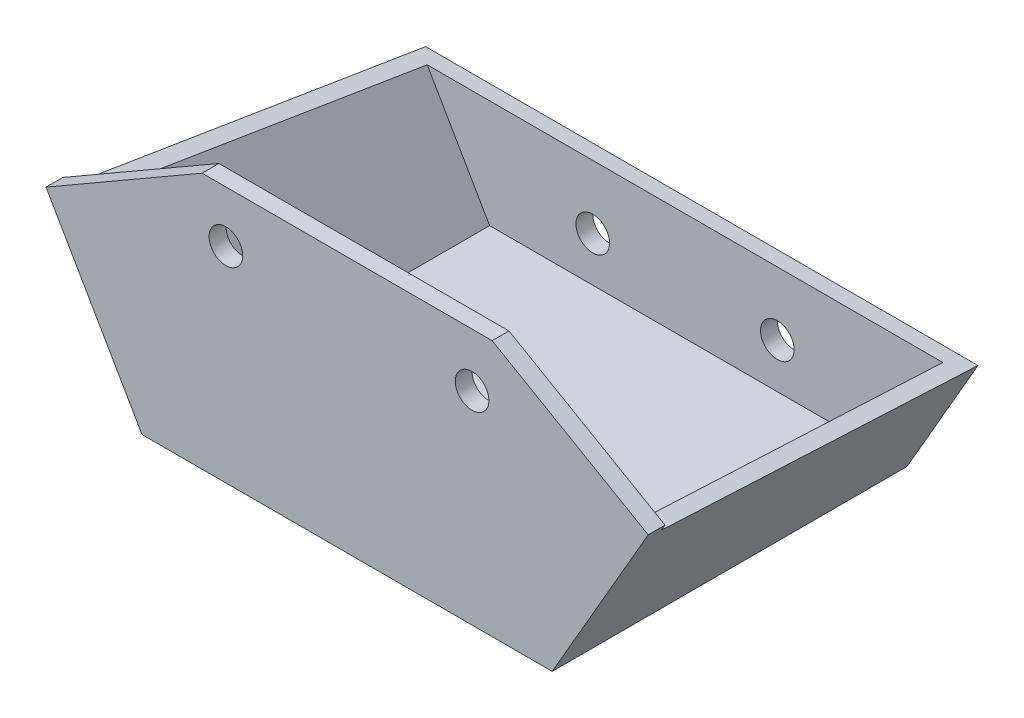
ISO-10303-21;
HEADER;
FILE_DESCRIPTION(('STEP AP214'),'2;1');
FILE_NAME('part.step','',(''),(''),'','','');
FILE_SCHEMA(('AUTOMOTIVE_DESIGN { 1 0 10303 214 1 1 1 1 }'));
ENDSEC;
DATA;
#1=APPLICATION_CONTEXT('core data for automotive mechanical design processes');
#2=APPLICATION_PROTOCOL_DEFINITION('international standard','automotive_design',2000,#1);
#3=PRODUCT_CONTEXT('',#1,'mechanical');
#4=PRODUCT('Part','Part','',(#3));
#5=PRODUCT_RELATED_PRODUCT_CATEGORY('part','',(#4));
#6=PRODUCT_DEFINITION_FORMATION('','',#4);
#7=PRODUCT_DEFINITION_CONTEXT('part definition',#1,'design');
#8=PRODUCT_DEFINITION('design','',#6,#7);
#9=PRODUCT_DEFINITION_SHAPE('','',#8);
#10=(LENGTH_UNIT() NAMED_UNIT(*) SI_UNIT(.MILLI.,.METRE.));
#11=(NAMED_UNIT(*) PLANE_ANGLE_UNIT() SI_UNIT($,.RADIAN.));
#12=(NAMED_UNIT(*) SI_UNIT($,.STERADIAN.) SOLID_ANGLE_UNIT());
#13=UNCERTAINTY_MEASURE_WITH_UNIT(LENGTH_MEASURE(1.E-05),#10,'distance_accuracy_value','');
#14=(GEOMETRIC_REPRESENTATION_CONTEXT(3) GLOBAL_UNCERTAINTY_ASSIGNED_CONTEXT((#13)) GLOBAL_UNIT_ASSIGNED_CONTEXT((#10,
#11,#12)) REPRESENTATION_CONTEXT('',''));
#15=CARTESIAN_POINT('',(0.,0.,0.));
#16=DIRECTION('',(0.,0.,1.));
#17=DIRECTION('',(1.,0.,0.));
#18=AXIS2_PLACEMENT_3D('',#15,#16,#17);
#19=CARTESIAN_POINT('',(-113.339745962156,4.99999999999998,211.));
#20=DIRECTION('',(0.866025403784439,0.499999999999998,0.));
#21=DIRECTION('',(-0.499999999999998,0.86602540378444,0.));
#22=AXIS2_PLACEMENT_3D('',#19,#20,#21);
#23=PLANE('',#22);
#24=DIRECTION('',(0.062808940230929,-0.108788275649526,-0.99207870056174));
#25=VECTOR('',#24,1.);
#26=CARTESIAN_POINT('',(-165.241405993873,94.896312172101,197.856332018932));
#27=LINE('',#26,#25);
#28=CARTESIAN_POINT('',(-165.440433000719,95.2410370600371,201.));
#29=VERTEX_POINT('',#28);
#30=CARTESIAN_POINT('',(-153.34813873282,74.296569007962,10.));
#31=VERTEX_POINT('',#30);
#32=EDGE_CURVE('E57',#29,#31,#27,.T.);
#33=ORIENTED_EDGE('',*,*,#32,.F.);
#34=DIRECTION('',(0.499999999999998,-0.86602540378444,0.));
#35=VECTOR('',#34,1.);
#36=CARTESIAN_POINT('',(-82.8397459621558,-47.8275496308506,201.));
#37=LINE('',#36,#35);
#38=CARTESIAN_POINT('',(-116.226497308104,10.,201.));
#39=VERTEX_POINT('',#38);
#40=EDGE_CURVE('E145',#29,#39,#37,.T.);
#41=ORIENTED_EDGE('',*,*,#40,.T.);
#42=DIRECTION('',(0.,0.,-1.));
#43=VECTOR('',#42,1.);
#44=CARTESIAN_POINT('',(-116.226497308104,10.,211.));
#45=LINE('',#44,#43);
#46=CARTESIAN_POINT('',(-116.226497308104,10.,10.));
#47=VERTEX_POINT('',#46);
#48=EDGE_CURVE('E278',#39,#47,#45,.T.);
#49=ORIENTED_EDGE('',*,*,#48,.T.);
#50=DIRECTION('',(0.499999999999998,-0.86602540378444,0.));
#51=VECTOR('',#50,1.);
#52=CARTESIAN_POINT('',(-82.8397459621558,-47.8275496308506,10.));
#53=LINE('',#52,#51);
#54=EDGE_CURVE('E261',#31,#47,#53,.T.);
#55=ORIENTED_EDGE('',*,*,#54,.F.);
#56=EDGE_LOOP('',(#33,#41,#49,#55));
#57=FACE_BOUND('',#56,.T.);
#58=ADVANCED_FACE('F41',(#57),#23,.T.);
#59=CARTESIAN_POINT('',(122.,10.,211.));
#60=DIRECTION('',(0.,1.,0.));
#61=DIRECTION('',(0.,0.,1.));
#62=AXIS2_PLACEMENT_3D('',#59,#60,#61);
#63=PLANE('',#62);
#64=DIRECTION('',(1.,0.,0.));
#65=VECTOR('',#64,1.);
#66=CARTESIAN_POINT('',(0.,10.,10.));
#67=LINE('',#66,#65);
#68=CARTESIAN_POINT('',(116.226497308104,10.,10.));
#69=VERTEX_POINT('',#68);
#70=EDGE_CURVE('E282',#47,#69,#67,.T.);
#71=ORIENTED_EDGE('',*,*,#70,.F.);
#72=ORIENTED_EDGE('',*,*,#48,.F.);
#73=DIRECTION('',(1.,0.,0.));
#74=VECTOR('',#73,1.);
#75=CARTESIAN_POINT('',(0.,10.,201.));
#76=LINE('',#75,#74);
#77=CARTESIAN_POINT('',(116.226497308104,10.,201.));
#78=VERTEX_POINT('',#77);
#79=EDGE_CURVE('E265',#39,#78,#76,.T.);
#80=ORIENTED_EDGE('',*,*,#79,.T.);
#81=DIRECTION('',(0.,0.,-1.));
#82=VECTOR('',#81,1.);
#83=CARTESIAN_POINT('',(116.226497308104,10.,211.));
#84=LINE('',#83,#82);
#85=EDGE_CURVE('E270',#78,#69,#84,.T.);
#86=ORIENTED_EDGE('',*,*,#85,.T.);
#87=EDGE_LOOP('',(#71,#72,#80,#86));
#88=FACE_BOUND('',#87,.T.);
#89=ADVANCED_FACE('F291',(#88),#63,.T.);
#90=CARTESIAN_POINT('',(113.339745962156,4.99999999999998,211.));
#91=DIRECTION('',(-0.86602540378444,0.499999999999998,0.));
#92=DIRECTION('',(-0.499999999999998,-0.86602540378444,0.));
#93=AXIS2_PLACEMENT_3D('',#90,#91,#92);
#94=PLANE('',#93);
#95=DIRECTION('',(0.062808940230929,0.108788275649526,0.99207870056174));
#96=VECTOR('',#95,1.);
#97=CARTESIAN_POINT('',(165.241405993872,94.896312172101,197.856332018932));
#98=LINE('',#97,#96);
#99=CARTESIAN_POINT('',(153.34813873282,74.296569007962,10.));
#100=VERTEX_POINT('',#99);
#101=CARTESIAN_POINT('',(165.440433000719,95.2410370600371,201.));
#102=VERTEX_POINT('',#101);
#103=EDGE_CURVE('E173',#100,#102,#98,.T.);
#104=ORIENTED_EDGE('',*,*,#103,.F.);
#105=DIRECTION('',(0.499999999999998,0.86602540378444,0.));
#106=VECTOR('',#105,1.);
#107=CARTESIAN_POINT('',(82.8397459621558,-47.8275496308506,10.));
#108=LINE('',#107,#106);
#109=EDGE_CURVE('E274',#69,#100,#108,.T.);
#110=ORIENTED_EDGE('',*,*,#109,.F.);
#111=ORIENTED_EDGE('',*,*,#85,.F.);
#112=DIRECTION('',(0.499999999999998,0.86602540378444,0.));
#113=VECTOR('',#112,1.);
#114=CARTESIAN_POINT('',(82.8397459621558,-47.8275496308506,201.));
#115=LINE('',#114,#113);
#116=EDGE_CURVE('E50',#78,#102,#115,.T.);
#117=ORIENTED_EDGE('',*,*,#116,.T.);
#118=EDGE_LOOP('',(#104,#110,#111,#117));
#119=FACE_BOUND('',#118,.T.);
#120=ADVANCED_FACE('F299',(#119),#94,.T.);
#121=CARTESIAN_POINT('',(0.,0.,201.));
#122=DIRECTION('',(0.,0.,-1.));
#123=DIRECTION('',(-1.,0.,0.));
#124=AXIS2_PLACEMENT_3D('',#121,#122,#123);
#125=PLANE('',#124);
#126=ORIENTED_EDGE('',*,*,#40,.F.);
#127=DIRECTION('',(1.,0.,0.));
#128=VECTOR('',#127,1.);
#129=CARTESIAN_POINT('',(-179.100687038563,95.2410370600371,201.));
#130=LINE('',#129,#128);
#131=CARTESIAN_POINT('',(-176.987438384511,95.2410370600371,201.));
#132=VERTEX_POINT('',#131);
#133=EDGE_CURVE('E131',#132,#29,#130,.T.);
#134=ORIENTED_EDGE('',*,*,#133,.F.);
#135=DIRECTION('',(0.499999999999998,-0.86602540378444,0.));
#136=VECTOR('',#135,1.);
#137=CARTESIAN_POINT('',(-122.,0.,201.));
#138=LINE('',#137,#136);
#139=CARTESIAN_POINT('',(-179.100687038563,98.9012910978815,201.));
#140=VERTEX_POINT('',#139);
#141=EDGE_CURVE('E142',#140,#132,#138,.T.);
#142=ORIENTED_EDGE('',*,*,#141,.F.);
#143=DIRECTION('',(-0.866025403784438,-0.500000000000001,0.));
#144=VECTOR('',#143,1.);
#145=CARTESIAN_POINT('',(-179.100687038563,98.9012910978815,201.));
#146=LINE('',#145,#144);
#147=CARTESIAN_POINT('',(-86.265,152.5,201.));
#148=VERTEX_POINT('',#147);
#149=EDGE_CURVE('E147',#148,#140,#146,.T.);
#150=ORIENTED_EDGE('',*,*,#149,.F.);
#151=DIRECTION('',(1.,0.,0.));
#152=VECTOR('',#151,1.);
#153=CARTESIAN_POINT('',(-179.100687038563,152.5,201.));
#154=LINE('',#153,#152);
#155=CARTESIAN_POINT('',(86.265,152.5,201.));
#156=VERTEX_POINT('',#155);
#157=EDGE_CURVE('E373',#148,#156,#154,.T.);
#158=ORIENTED_EDGE('',*,*,#157,.T.);
#159=DIRECTION('',(-0.866025403784438,0.500000000000001,0.));
#160=VECTOR('',#159,1.);
#161=CARTESIAN_POINT('',(179.100687038563,98.9012910978816,201.));
#162=LINE('',#161,#160);
#163=CARTESIAN_POINT('',(179.100687038563,98.9012910978816,201.));
#164=VERTEX_POINT('',#163);
#165=EDGE_CURVE('E156',#164,#156,#162,.T.);
#166=ORIENTED_EDGE('',*,*,#165,.F.);
#167=DIRECTION('',(0.499999999999998,0.86602540378444,0.));
#168=VECTOR('',#167,1.);
#169=CARTESIAN_POINT('',(122.,0.,201.));
#170=LINE('',#169,#168);
#171=CARTESIAN_POINT('',(176.987438384511,95.2410370600372,201.));
#172=VERTEX_POINT('',#171);
#173=EDGE_CURVE('E161',#172,#164,#170,.T.);
#174=ORIENTED_EDGE('',*,*,#173,.F.);
#175=EDGE_CURVE('E148',#102,#172,#130,.T.);
#176=ORIENTED_EDGE('',*,*,#175,.F.);
#177=ORIENTED_EDGE('',*,*,#116,.F.);
#178=ORIENTED_EDGE('',*,*,#79,.F.);
#179=EDGE_LOOP('',(#126,#134,#142,#150,#158,#166,#174,#176,#177,#178));
#180=FACE_BOUND('',#179,.T.);
#181=CARTESIAN_POINT('',(-72.0891231958278,122.,201.));
#182=DIRECTION('',(0.,0.,-1.));
#183=DIRECTION('',(-1.,0.,0.));
#184=AXIS2_PLACEMENT_3D('',#181,#182,#183);
#185=CIRCLE('',#184,10.);
#186=CARTESIAN_POINT('',(-82.0891231958279,122.,201.));
#187=VERTEX_POINT('',#186);
#188=EDGE_CURVE('E179',#187,#187,#185,.F.);
#189=ORIENTED_EDGE('',*,*,#188,.T.);
#190=EDGE_LOOP('',(#189));
#191=FACE_BOUND('',#190,.T.);
#192=CARTESIAN_POINT('',(74.3108768041722,120.659584251473,201.));
#193=DIRECTION('',(0.,0.,-1.));
#194=DIRECTION('',(-1.,0.,0.));
#195=AXIS2_PLACEMENT_3D('',#192,#193,#194);
#196=CIRCLE('',#195,9.99999999999999);
#197=CARTESIAN_POINT('',(64.3108768041722,120.659584251473,201.));
#198=VERTEX_POINT('',#197);
#199=EDGE_CURVE('E178',#198,#198,#196,.F.);
#200=ORIENTED_EDGE('',*,*,#199,.T.);
#201=EDGE_LOOP('',(#200));
#202=FACE_BOUND('',#201,.T.);
#203=ADVANCED_FACE('F140',(#180,#191,#202),#125,.T.);
#204=CARTESIAN_POINT('',(0.,0.,10.));
#205=DIRECTION('',(0.,0.,-1.));
#206=DIRECTION('',(-1.,0.,0.));
#207=AXIS2_PLACEMENT_3D('',#204,#205,#206);
#208=PLANE('',#207);
#209=CARTESIAN_POINT('',(54.9,36.6,10.));
#210=DIRECTION('',(0.,0.,-1.));
#211=DIRECTION('',(-1.,0.,0.));
#212=AXIS2_PLACEMENT_3D('',#209,#210,#211);
#213=CIRCLE('',#212,9.99999999999999);
#214=CARTESIAN_POINT('',(44.9,36.6,10.));
#215=VERTEX_POINT('',#214);
#216=EDGE_CURVE('E199',#215,#215,#213,.F.);
#217=ORIENTED_EDGE('',*,*,#216,.F.);
#218=EDGE_LOOP('',(#217));
#219=FACE_BOUND('',#218,.T.);
#220=CARTESIAN_POINT('',(-54.9,36.6,10.));
#221=DIRECTION('',(0.,0.,-1.));
#222=DIRECTION('',(-1.,0.,0.));
#223=AXIS2_PLACEMENT_3D('',#220,#221,#222);
#224=CIRCLE('',#223,9.99999999999999);
#225=CARTESIAN_POINT('',(-64.9,36.6,10.));
#226=VERTEX_POINT('',#225);
#227=EDGE_CURVE('E200',#226,#226,#224,.F.);
#228=ORIENTED_EDGE('',*,*,#227,.F.);
#229=EDGE_LOOP('',(#228));
#230=FACE_BOUND('',#229,.T.);
#231=ORIENTED_EDGE('',*,*,#109,.T.);
#232=DIRECTION('',(-1.,0.,0.));
#233=VECTOR('',#232,1.);
#234=CARTESIAN_POINT('',(0.,74.296569007962,10.));
#235=LINE('',#234,#233);
#236=EDGE_CURVE('E136',#100,#31,#235,.T.);
#237=ORIENTED_EDGE('',*,*,#236,.T.);
#238=ORIENTED_EDGE('',*,*,#54,.T.);
#239=ORIENTED_EDGE('',*,*,#70,.T.);
#240=EDGE_LOOP('',(#231,#237,#238,#239));
#241=FACE_BOUND('',#240,.T.);
#242=ADVANCED_FACE('F43',(#219,#230,#241),#208,.F.);
#243=CARTESIAN_POINT('',(-54.9,36.6,211.001));
#244=DIRECTION('',(0.,0.,-1.));
#245=DIRECTION('',(-1.,0.,0.));
#246=AXIS2_PLACEMENT_3D('',#243,#244,#245);
#247=CYLINDRICAL_SURFACE('',#246,9.99999999999999);
#248=CARTESIAN_POINT('',(-54.9,36.6,0.));
#249=DIRECTION('',(0.,0.,-1.));
#250=DIRECTION('',(-1.,0.,0.));
#251=AXIS2_PLACEMENT_3D('',#248,#249,#250);
#252=CIRCLE('',#251,9.99999999999999);
#253=CARTESIAN_POINT('',(-64.9,36.6,0.));
#254=VERTEX_POINT('',#253);
#255=EDGE_CURVE('E188',#254,#254,#252,.T.);
#256=ORIENTED_EDGE('',*,*,#255,.T.);
#257=EDGE_LOOP('',(#256));
#258=FACE_BOUND('',#257,.T.);
#259=ORIENTED_EDGE('',*,*,#227,.T.);
#260=EDGE_LOOP('',(#259));
#261=FACE_BOUND('',#260,.T.);
#262=ADVANCED_FACE('F310',(#258,#261),#247,.F.);
#263=CARTESIAN_POINT('',(54.9,36.6,211.001));
#264=DIRECTION('',(0.,0.,-1.));
#265=DIRECTION('',(-1.,0.,0.));
#266=AXIS2_PLACEMENT_3D('',#263,#264,#265);
#267=CYLINDRICAL_SURFACE('',#266,9.99999999999999);
#268=CARTESIAN_POINT('',(54.9,36.6,0.));
#269=DIRECTION('',(0.,0.,-1.));
#270=DIRECTION('',(-1.,0.,0.));
#271=AXIS2_PLACEMENT_3D('',#268,#269,#270);
#272=CIRCLE('',#271,9.99999999999999);
#273=CARTESIAN_POINT('',(44.9,36.6,0.));
#274=VERTEX_POINT('',#273);
#275=EDGE_CURVE('E195',#274,#274,#272,.T.);
#276=ORIENTED_EDGE('',*,*,#275,.T.);
#277=EDGE_LOOP('',(#276));
#278=FACE_BOUND('',#277,.T.);
#279=ORIENTED_EDGE('',*,*,#216,.T.);
#280=EDGE_LOOP('',(#279));
#281=FACE_BOUND('',#280,.T.);
#282=ADVANCED_FACE('F315',(#278,#281),#267,.F.);
#283=CARTESIAN_POINT('',(-122.,0.,211.));
#284=DIRECTION('',(0.866025403784439,0.499999999999998,0.));
#285=DIRECTION('',(-0.499999999999998,0.86602540378444,0.));
#286=AXIS2_PLACEMENT_3D('',#283,#284,#285);
#287=PLANE('',#286);
#288=ORIENTED_EDGE('',*,*,#141,.T.);
#289=DIRECTION('',(0.062808940230929,-0.108788275649526,-0.99207870056174));
#290=VECTOR('',#289,1.);
#291=CARTESIAN_POINT('',(-176.742858868978,94.8174129126424,197.136821811314));
#292=LINE('',#291,#290);
#293=CARTESIAN_POINT('',(-164.26203970468,73.2,0.));
#294=VERTEX_POINT('',#293);
#295=EDGE_CURVE('E128',#132,#294,#292,.T.);
#296=ORIENTED_EDGE('',*,*,#295,.T.);
#297=DIRECTION('',(0.499999999999998,-0.86602540378444,0.));
#298=VECTOR('',#297,1.);
#299=CARTESIAN_POINT('',(-122.,0.,0.));
#300=LINE('',#299,#298);
#301=CARTESIAN_POINT('',(-122.,0.,0.));
#302=VERTEX_POINT('',#301);
#303=EDGE_CURVE('E204',#294,#302,#300,.T.);
#304=ORIENTED_EDGE('',*,*,#303,.T.);
#305=DIRECTION('',(0.,0.,-1.));
#306=VECTOR('',#305,1.);
#307=CARTESIAN_POINT('',(-122.,0.,211.));
#308=LINE('',#307,#306);
#309=CARTESIAN_POINT('',(-122.,0.,211.));
#310=VERTEX_POINT('',#309);
#311=EDGE_CURVE('E257',#310,#302,#308,.T.);
#312=ORIENTED_EDGE('',*,*,#311,.F.);
#313=DIRECTION('',(0.499999999999998,-0.86602540378444,0.));
#314=VECTOR('',#313,1.);
#315=CARTESIAN_POINT('',(-122.,0.,211.));
#316=LINE('',#315,#314);
#317=CARTESIAN_POINT('',(-179.100687038563,98.9012910978815,211.));
#318=VERTEX_POINT('',#317);
#319=EDGE_CURVE('E211',#318,#310,#316,.T.);
#320=ORIENTED_EDGE('',*,*,#319,.F.);
#321=DIRECTION('',(0.,0.,-1.));
#322=VECTOR('',#321,1.);
#323=CARTESIAN_POINT('',(-179.100687038563,98.9012910978815,211.));
#324=LINE('',#323,#322);
#325=EDGE_CURVE('E154',#318,#140,#324,.T.);
#326=ORIENTED_EDGE('',*,*,#325,.T.);
#327=EDGE_LOOP('',(#288,#296,#304,#312,#320,#326));
#328=FACE_BOUND('',#327,.T.);
#329=ADVANCED_FACE('F151',(#328),#287,.F.);
#330=CARTESIAN_POINT('',(122.,0.,211.));
#331=DIRECTION('',(0.,1.,0.));
#332=DIRECTION('',(0.,0.,1.));
#333=AXIS2_PLACEMENT_3D('',#330,#331,#332);
#334=PLANE('',#333);
#335=DIRECTION('',(1.,0.,0.));
#336=VECTOR('',#335,1.);
#337=CARTESIAN_POINT('',(122.,0.,0.));
#338=LINE('',#337,#336);
#339=CARTESIAN_POINT('',(122.,0.,0.));
#340=VERTEX_POINT('',#339);
#341=EDGE_CURVE('E233',#302,#340,#338,.T.);
#342=ORIENTED_EDGE('',*,*,#341,.T.);
#343=DIRECTION('',(0.,0.,-1.));
#344=VECTOR('',#343,1.);
#345=CARTESIAN_POINT('',(122.,0.,211.));
#346=LINE('',#345,#344);
#347=CARTESIAN_POINT('',(122.,0.,211.));
#348=VERTEX_POINT('',#347);
#349=EDGE_CURVE('E253',#348,#340,#346,.T.);
#350=ORIENTED_EDGE('',*,*,#349,.F.);
#351=DIRECTION('',(1.,0.,0.));
#352=VECTOR('',#351,1.);
#353=CARTESIAN_POINT('',(122.,0.,211.));
#354=LINE('',#353,#352);
#355=EDGE_CURVE('E215',#310,#348,#354,.T.);
#356=ORIENTED_EDGE('',*,*,#355,.F.);
#357=ORIENTED_EDGE('',*,*,#311,.T.);
#358=EDGE_LOOP('',(#342,#350,#356,#357));
#359=FACE_BOUND('',#358,.T.);
#360=ADVANCED_FACE('F329',(#359),#334,.F.);
#361=CARTESIAN_POINT('',(122.,0.,211.));
#362=DIRECTION('',(-0.86602540378444,0.499999999999998,0.));
#363=DIRECTION('',(-0.499999999999998,-0.86602540378444,0.));
#364=AXIS2_PLACEMENT_3D('',#361,#362,#363);
#365=PLANE('',#364);
#366=DIRECTION('',(0.499999999999998,0.86602540378444,0.));
#367=VECTOR('',#366,1.);
#368=CARTESIAN_POINT('',(122.,0.,0.));
#369=LINE('',#368,#367);
#370=CARTESIAN_POINT('',(164.26203970468,73.2,0.));
#371=VERTEX_POINT('',#370);
#372=EDGE_CURVE('E216',#340,#371,#369,.T.);
#373=ORIENTED_EDGE('',*,*,#372,.T.);
#374=DIRECTION('',(0.062808940230929,0.108788275649526,0.99207870056174));
#375=VECTOR('',#374,1.);
#376=CARTESIAN_POINT('',(176.742858868978,94.8174129126424,197.136821811314));
#377=LINE('',#376,#375);
#378=EDGE_CURVE('E63',#371,#172,#377,.T.);
#379=ORIENTED_EDGE('',*,*,#378,.T.);
#380=ORIENTED_EDGE('',*,*,#173,.T.);
#381=DIRECTION('',(0.,0.,-1.));
#382=VECTOR('',#381,1.);
#383=CARTESIAN_POINT('',(179.100687038563,98.9012910978816,211.));
#384=LINE('',#383,#382);
#385=CARTESIAN_POINT('',(179.100687038563,98.9012910978816,211.));
#386=VERTEX_POINT('',#385);
#387=EDGE_CURVE('E249',#386,#164,#384,.T.);
#388=ORIENTED_EDGE('',*,*,#387,.F.);
#389=DIRECTION('',(0.499999999999998,0.86602540378444,0.));
#390=VECTOR('',#389,1.);
#391=CARTESIAN_POINT('',(122.,0.,211.));
#392=LINE('',#391,#390);
#393=EDGE_CURVE('E219',#348,#386,#392,.T.);
#394=ORIENTED_EDGE('',*,*,#393,.F.);
#395=ORIENTED_EDGE('',*,*,#349,.T.);
#396=EDGE_LOOP('',(#373,#379,#380,#388,#394,#395));
#397=FACE_BOUND('',#396,.T.);
#398=ADVANCED_FACE('F353',(#397),#365,.F.);
#399=CARTESIAN_POINT('',(179.100687038563,98.9012910978816,211.));
#400=DIRECTION('',(-0.500000000000001,-0.866025403784438,0.));
#401=DIRECTION('',(0.866025403784438,-0.500000000000001,0.));
#402=AXIS2_PLACEMENT_3D('',#399,#400,#401);
#403=PLANE('',#402);
#404=ORIENTED_EDGE('',*,*,#387,.T.);
#405=ORIENTED_EDGE('',*,*,#165,.T.);
#406=DIRECTION('',(0.,0.,-1.));
#407=VECTOR('',#406,1.);
#408=CARTESIAN_POINT('',(86.265,152.5,211.));
#409=LINE('',#408,#407);
#410=CARTESIAN_POINT('',(86.265,152.5,211.));
#411=VERTEX_POINT('',#410);
#412=EDGE_CURVE('E245',#411,#156,#409,.T.);
#413=ORIENTED_EDGE('',*,*,#412,.F.);
#414=DIRECTION('',(-0.866025403784438,0.500000000000001,0.));
#415=VECTOR('',#414,1.);
#416=CARTESIAN_POINT('',(179.100687038563,98.9012910978816,211.));
#417=LINE('',#416,#415);
#418=EDGE_CURVE('E222',#386,#411,#417,.T.);
#419=ORIENTED_EDGE('',*,*,#418,.F.);
#420=EDGE_LOOP('',(#404,#405,#413,#419));
#421=FACE_BOUND('',#420,.T.);
#422=ADVANCED_FACE('F349',(#421),#403,.F.);
#423=CARTESIAN_POINT('',(-86.265,152.5,211.));
#424=DIRECTION('',(0.,-1.,0.));
#425=DIRECTION('',(0.,0.,-1.));
#426=AXIS2_PLACEMENT_3D('',#423,#424,#425);
#427=PLANE('',#426);
#428=ORIENTED_EDGE('',*,*,#412,.T.);
#429=ORIENTED_EDGE('',*,*,#157,.F.);
#430=DIRECTION('',(0.,0.,-1.));
#431=VECTOR('',#430,1.);
#432=CARTESIAN_POINT('',(-86.265,152.5,211.));
#433=LINE('',#432,#431);
#434=CARTESIAN_POINT('',(-86.265,152.5,211.));
#435=VERTEX_POINT('',#434);
#436=EDGE_CURVE('E241',#435,#148,#433,.T.);
#437=ORIENTED_EDGE('',*,*,#436,.F.);
#438=DIRECTION('',(-1.,0.,0.));
#439=VECTOR('',#438,1.);
#440=CARTESIAN_POINT('',(-86.265,152.5,211.));
#441=LINE('',#440,#439);
#442=EDGE_CURVE('E225',#411,#435,#441,.T.);
#443=ORIENTED_EDGE('',*,*,#442,.F.);
#444=EDGE_LOOP('',(#428,#429,#437,#443));
#445=FACE_BOUND('',#444,.T.);
#446=ADVANCED_FACE('F345',(#445),#427,.F.);
#447=CARTESIAN_POINT('',(-179.100687038563,98.9012910978815,211.));
#448=DIRECTION('',(0.500000000000001,-0.866025403784438,0.));
#449=DIRECTION('',(0.866025403784438,0.500000000000001,0.));
#450=AXIS2_PLACEMENT_3D('',#447,#448,#449);
#451=PLANE('',#450);
#452=ORIENTED_EDGE('',*,*,#436,.T.);
#453=ORIENTED_EDGE('',*,*,#149,.T.);
#454=ORIENTED_EDGE('',*,*,#325,.F.);
#455=DIRECTION('',(-0.866025403784438,-0.500000000000001,0.));
#456=VECTOR('',#455,1.);
#457=CARTESIAN_POINT('',(-179.100687038563,98.9012910978815,211.));
#458=LINE('',#457,#456);
#459=EDGE_CURVE('E228',#435,#318,#458,.T.);
#460=ORIENTED_EDGE('',*,*,#459,.F.);
#461=EDGE_LOOP('',(#452,#453,#454,#460));
#462=FACE_BOUND('',#461,.T.);
#463=ADVANCED_FACE('F338',(#462),#451,.F.);
#464=CARTESIAN_POINT('',(0.,0.,211.));
#465=DIRECTION('',(0.,0.,-1.));
#466=DIRECTION('',(-1.,0.,0.));
#467=AXIS2_PLACEMENT_3D('',#464,#465,#466);
#468=PLANE('',#467);
#469=CARTESIAN_POINT('',(-72.0891231958278,122.,211.));
#470=DIRECTION('',(0.,0.,1.));
#471=DIRECTION('',(1.,0.,0.));
#472=AXIS2_PLACEMENT_3D('',#469,#470,#471);
#473=CIRCLE('',#472,10.);
#474=CARTESIAN_POINT('',(-62.0891231958278,122.,211.));
#475=VERTEX_POINT('',#474);
#476=EDGE_CURVE('E183',#475,#475,#473,.T.);
#477=ORIENTED_EDGE('',*,*,#476,.F.);
#478=EDGE_LOOP('',(#477));
#479=FACE_BOUND('',#478,.T.);
#480=CARTESIAN_POINT('',(74.3108768041722,120.659584251473,211.));
#481=DIRECTION('',(0.,0.,1.));
#482=DIRECTION('',(1.,0.,0.));
#483=AXIS2_PLACEMENT_3D('',#480,#481,#482);
#484=CIRCLE('',#483,9.99999999999999);
#485=CARTESIAN_POINT('',(84.3108768041722,120.659584251473,211.));
#486=VERTEX_POINT('',#485);
#487=EDGE_CURVE('E184',#486,#486,#484,.T.);
#488=ORIENTED_EDGE('',*,*,#487,.F.);
#489=EDGE_LOOP('',(#488));
#490=FACE_BOUND('',#489,.T.);
#491=ORIENTED_EDGE('',*,*,#319,.T.);
#492=ORIENTED_EDGE('',*,*,#355,.T.);
#493=ORIENTED_EDGE('',*,*,#393,.T.);
#494=ORIENTED_EDGE('',*,*,#418,.T.);
#495=ORIENTED_EDGE('',*,*,#442,.T.);
#496=ORIENTED_EDGE('',*,*,#459,.T.);
#497=EDGE_LOOP('',(#491,#492,#493,#494,#495,#496));
#498=FACE_BOUND('',#497,.T.);
#499=ADVANCED_FACE('F334',(#479,#490,#498),#468,.F.);
#500=CARTESIAN_POINT('',(0.,0.,0.));
#501=DIRECTION('',(0.,0.,-1.));
#502=DIRECTION('',(-1.,0.,0.));
#503=AXIS2_PLACEMENT_3D('',#500,#501,#502);
#504=PLANE('',#503);
#505=DIRECTION('',(-1.,0.,0.));
#506=VECTOR('',#505,1.);
#507=CARTESIAN_POINT('',(0.,73.2,0.));
#508=LINE('',#507,#506);
#509=EDGE_CURVE('E11',#371,#294,#508,.T.);
#510=ORIENTED_EDGE('',*,*,#509,.F.);
#511=ORIENTED_EDGE('',*,*,#372,.F.);
#512=ORIENTED_EDGE('',*,*,#341,.F.);
#513=ORIENTED_EDGE('',*,*,#303,.F.);
#514=EDGE_LOOP('',(#510,#511,#512,#513));
#515=FACE_BOUND('',#514,.T.);
#516=ORIENTED_EDGE('',*,*,#275,.F.);
#517=EDGE_LOOP('',(#516));
#518=FACE_BOUND('',#517,.T.);
#519=ORIENTED_EDGE('',*,*,#255,.F.);
#520=EDGE_LOOP('',(#519));
#521=FACE_BOUND('',#520,.T.);
#522=ADVANCED_FACE('F337',(#515,#518,#521),#504,.T.);
#523=CARTESIAN_POINT('',(74.3108768041722,120.659584251473,-0.001000000000001));
#524=DIRECTION('',(0.,0.,1.));
#525=DIRECTION('',(1.,0.,0.));
#526=AXIS2_PLACEMENT_3D('',#523,#524,#525);
#527=CYLINDRICAL_SURFACE('',#526,9.99999999999999);
#528=ORIENTED_EDGE('',*,*,#199,.F.);
#529=EDGE_LOOP('',(#528));
#530=FACE_BOUND('',#529,.T.);
#531=ORIENTED_EDGE('',*,*,#487,.T.);
#532=EDGE_LOOP('',(#531));
#533=FACE_BOUND('',#532,.T.);
#534=ADVANCED_FACE('F331',(#530,#533),#527,.F.);
#535=CARTESIAN_POINT('',(-72.0891231958278,122.,-0.001000000000001));
#536=DIRECTION('',(0.,0.,1.));
#537=DIRECTION('',(1.,0.,0.));
#538=AXIS2_PLACEMENT_3D('',#535,#536,#537);
#539=CYLINDRICAL_SURFACE('',#538,10.);
#540=ORIENTED_EDGE('',*,*,#188,.F.);
#541=EDGE_LOOP('',(#540));
#542=FACE_BOUND('',#541,.T.);
#543=ORIENTED_EDGE('',*,*,#476,.T.);
#544=EDGE_LOOP('',(#543));
#545=FACE_BOUND('',#544,.T.);
#546=ADVANCED_FACE('F418',(#542,#545),#539,.F.);
#547=CARTESIAN_POINT('',(-179.100687038563,73.2,0.));
#548=DIRECTION('',(0.,-0.994041366327348,0.109003495494682));
#549=DIRECTION('',(0.,-0.109003495494682,-0.994041366327348));
#550=AXIS2_PLACEMENT_3D('',#547,#548,#549);
#551=PLANE('',#550);
#552=ORIENTED_EDGE('',*,*,#32,.T.);
#553=ORIENTED_EDGE('',*,*,#236,.F.);
#554=ORIENTED_EDGE('',*,*,#103,.T.);
#555=ORIENTED_EDGE('',*,*,#175,.T.);
#556=ORIENTED_EDGE('',*,*,#378,.F.);
#557=ORIENTED_EDGE('',*,*,#509,.T.);
#558=ORIENTED_EDGE('',*,*,#295,.F.);
#559=ORIENTED_EDGE('',*,*,#133,.T.);
#560=EDGE_LOOP('',(#552,#553,#554,#555,#556,#557,#558,#559));
#561=FACE_BOUND('',#560,.T.);
#562=ADVANCED_FACE('F130',(#561),#551,.F.);
#563=CLOSED_SHELL('',(#58,#89,#120,#203,#242,#262,#282,#329,#360,#398,#422,#446,#463,#499,#522,
#534,#546,#562));
#564=MANIFOLD_SOLID_BREP('B2',#563);
#565=ADVANCED_BREP_SHAPE_REPRESENTATION('',(#18,#564),#14);
#566=SHAPE_DEFINITION_REPRESENTATION(#9,#565);
ENDSEC;
END-ISO-10303-21;
